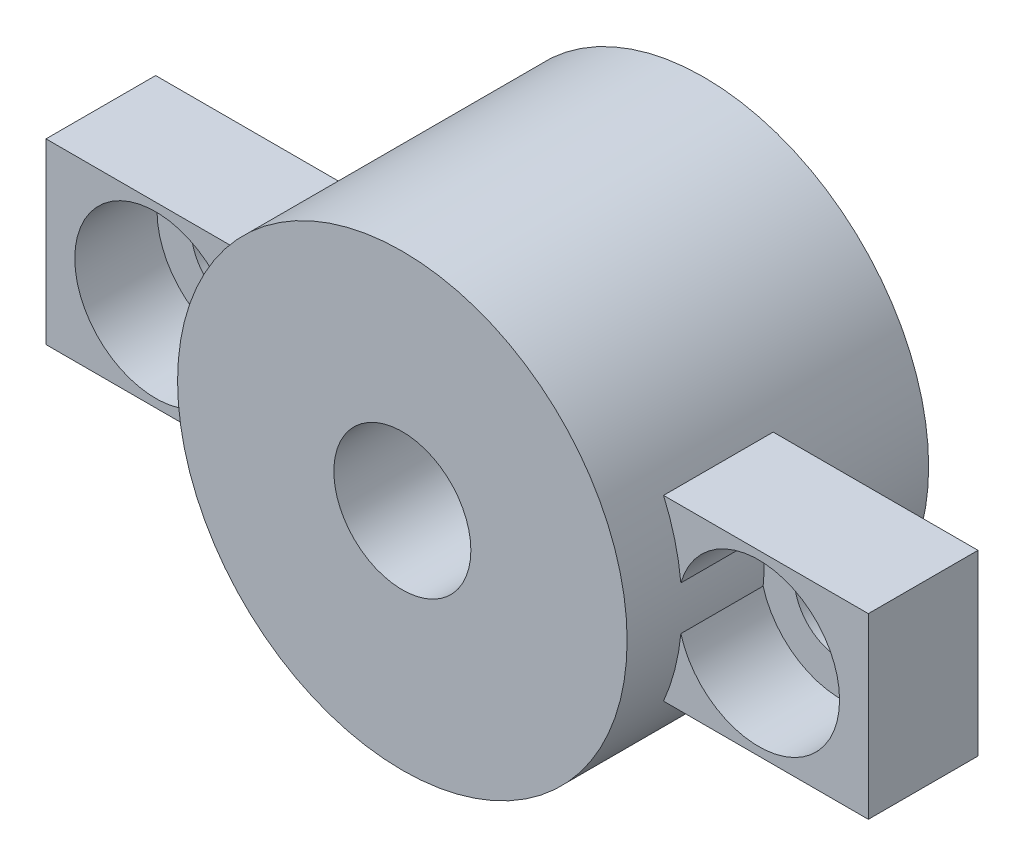
ISO-10303-21;
HEADER;
FILE_DESCRIPTION(('STEP AP214'),'2;1');
FILE_NAME('part.step','',(''),(''),'','','');
FILE_SCHEMA(('AUTOMOTIVE_DESIGN { 1 0 10303 214 1 1 1 1 }'));
ENDSEC;
DATA;
#1=APPLICATION_CONTEXT('core data for automotive mechanical design processes');
#2=APPLICATION_PROTOCOL_DEFINITION('international standard','automotive_design',2000,#1);
#3=PRODUCT_CONTEXT('',#1,'mechanical');
#4=PRODUCT('Part','Part','',(#3));
#5=PRODUCT_RELATED_PRODUCT_CATEGORY('part','',(#4));
#6=PRODUCT_DEFINITION_FORMATION('','',#4);
#7=PRODUCT_DEFINITION_CONTEXT('part definition',#1,'design');
#8=PRODUCT_DEFINITION('design','',#6,#7);
#9=PRODUCT_DEFINITION_SHAPE('','',#8);
#10=(LENGTH_UNIT() NAMED_UNIT(*) SI_UNIT(.MILLI.,.METRE.));
#11=(NAMED_UNIT(*) PLANE_ANGLE_UNIT() SI_UNIT($,.RADIAN.));
#12=(NAMED_UNIT(*) SI_UNIT($,.STERADIAN.) SOLID_ANGLE_UNIT());
#13=UNCERTAINTY_MEASURE_WITH_UNIT(LENGTH_MEASURE(1.E-05),#10,'distance_accuracy_value','');
#14=(GEOMETRIC_REPRESENTATION_CONTEXT(3) GLOBAL_UNCERTAINTY_ASSIGNED_CONTEXT((#13)) GLOBAL_UNIT_ASSIGNED_CONTEXT((#10,
#11,#12)) REPRESENTATION_CONTEXT('',''));
#15=CARTESIAN_POINT('',(0.,0.,0.));
#16=DIRECTION('',(0.,0.,1.));
#17=DIRECTION('',(1.,0.,0.));
#18=AXIS2_PLACEMENT_3D('',#15,#16,#17);
#19=CARTESIAN_POINT('',(0.,0.,-5.));
#20=DIRECTION('',(0.,0.,1.));
#21=DIRECTION('',(1.,0.,0.));
#22=AXIS2_PLACEMENT_3D('',#19,#20,#21);
#23=CYLINDRICAL_SURFACE('',#22,8.2);
#24=DIRECTION('',(0.,0.,1.));
#25=VECTOR('',#24,1.);
#26=CARTESIAN_POINT('',(7.52844605479776,-3.25,-5.));
#27=LINE('',#26,#25);
#28=CARTESIAN_POINT('',(7.52844605479776,-3.25,4.));
#29=VERTEX_POINT('',#28);
#30=CARTESIAN_POINT('',(7.52844605479776,-3.25,0.));
#31=VERTEX_POINT('',#30);
#32=EDGE_CURVE('E335',#29,#31,#27,.F.);
#33=ORIENTED_EDGE('',*,*,#32,.F.);
#34=CARTESIAN_POINT('',(0.,0.,4.));
#35=DIRECTION('',(0.,0.,1.));
#36=DIRECTION('',(1.,0.,0.));
#37=AXIS2_PLACEMENT_3D('',#34,#35,#36);
#38=CIRCLE('',#37,8.2);
#39=CARTESIAN_POINT('',(8.16079545454545,-0.800885478124208,4.));
#40=VERTEX_POINT('',#39);
#41=EDGE_CURVE('E149',#29,#40,#38,.T.);
#42=ORIENTED_EDGE('',*,*,#41,.T.);
#43=DIRECTION('',(0.,0.,1.));
#44=VECTOR('',#43,1.);
#45=CARTESIAN_POINT('',(8.16079545454545,-0.800885478124208,0.5));
#46=LINE('',#45,#44);
#47=CARTESIAN_POINT('',(8.16079545454545,-0.800885478124208,1.));
#48=VERTEX_POINT('',#47);
#49=EDGE_CURVE('E11',#48,#40,#46,.T.);
#50=ORIENTED_EDGE('',*,*,#49,.F.);
#51=CARTESIAN_POINT('',(0.,0.,1.));
#52=DIRECTION('',(0.,0.,1.));
#53=DIRECTION('',(1.,0.,0.));
#54=AXIS2_PLACEMENT_3D('',#51,#52,#53);
#55=CIRCLE('',#54,8.2);
#56=CARTESIAN_POINT('',(8.16079545454545,0.800885478124215,1.));
#57=VERTEX_POINT('',#56);
#58=EDGE_CURVE('E64',#48,#57,#55,.T.);
#59=ORIENTED_EDGE('',*,*,#58,.T.);
#60=DIRECTION('',(0.,0.,1.));
#61=VECTOR('',#60,1.);
#62=CARTESIAN_POINT('',(8.16079545454545,0.800885478124215,0.5));
#63=LINE('',#62,#61);
#64=CARTESIAN_POINT('',(8.16079545454545,0.800885478124215,4.));
#65=VERTEX_POINT('',#64);
#66=EDGE_CURVE('E49',#65,#57,#63,.F.);
#67=ORIENTED_EDGE('',*,*,#66,.F.);
#68=CARTESIAN_POINT('',(7.52844605479776,3.25,4.));
#69=VERTEX_POINT('',#68);
#70=EDGE_CURVE('E129',#65,#69,#38,.T.);
#71=ORIENTED_EDGE('',*,*,#70,.T.);
#72=DIRECTION('',(0.,0.,1.));
#73=VECTOR('',#72,1.);
#74=CARTESIAN_POINT('',(7.52844605479776,3.25,-5.));
#75=LINE('',#74,#73);
#76=CARTESIAN_POINT('',(7.52844605479776,3.25,0.));
#77=VERTEX_POINT('',#76);
#78=EDGE_CURVE('E146',#77,#69,#75,.T.);
#79=ORIENTED_EDGE('',*,*,#78,.F.);
#80=CARTESIAN_POINT('',(0.,0.,0.));
#81=DIRECTION('',(0.,0.,1.));
#82=DIRECTION('',(1.,0.,0.));
#83=AXIS2_PLACEMENT_3D('',#80,#81,#82);
#84=CIRCLE('',#83,8.2);
#85=EDGE_CURVE('E322',#31,#77,#84,.T.);
#86=ORIENTED_EDGE('',*,*,#85,.F.);
#87=EDGE_LOOP('',(#33,#42,#50,#59,#67,#71,#79,#86));
#88=FACE_BOUND('',#87,.T.);
#89=CARTESIAN_POINT('',(0.,0.,-5.));
#90=DIRECTION('',(0.,0.,1.));
#91=DIRECTION('',(1.,0.,0.));
#92=AXIS2_PLACEMENT_3D('',#89,#90,#91);
#93=CIRCLE('',#92,8.2);
#94=CARTESIAN_POINT('',(8.2,0.,-5.));
#95=VERTEX_POINT('',#94);
#96=EDGE_CURVE('E393',#95,#95,#93,.T.);
#97=ORIENTED_EDGE('',*,*,#96,.T.);
#98=EDGE_LOOP('',(#97));
#99=FACE_BOUND('',#98,.T.);
#100=CARTESIAN_POINT('',(0.,0.,6.00000000000001));
#101=DIRECTION('',(0.,0.,1.));
#102=DIRECTION('',(1.,0.,0.));
#103=AXIS2_PLACEMENT_3D('',#100,#101,#102);
#104=CIRCLE('',#103,8.2);
#105=CARTESIAN_POINT('',(8.2,0.,6.00000000000001));
#106=VERTEX_POINT('',#105);
#107=EDGE_CURVE('E384',#106,#106,#104,.T.);
#108=ORIENTED_EDGE('',*,*,#107,.F.);
#109=EDGE_LOOP('',(#108));
#110=FACE_BOUND('',#109,.T.);
#111=DIRECTION('',(0.,0.,1.));
#112=VECTOR('',#111,1.);
#113=CARTESIAN_POINT('',(-7.52844605479776,3.25,-5.));
#114=LINE('',#113,#112);
#115=CARTESIAN_POINT('',(-7.52844605479776,3.25,4.));
#116=VERTEX_POINT('',#115);
#117=CARTESIAN_POINT('',(-7.52844605479776,3.25,0.));
#118=VERTEX_POINT('',#117);
#119=EDGE_CURVE('E153',#116,#118,#114,.F.);
#120=ORIENTED_EDGE('',*,*,#119,.F.);
#121=CARTESIAN_POINT('',(-8.16079545454546,0.800885478124215,4.));
#122=VERTEX_POINT('',#121);
#123=EDGE_CURVE('E148',#116,#122,#38,.T.);
#124=ORIENTED_EDGE('',*,*,#123,.T.);
#125=DIRECTION('',(0.,0.,1.));
#126=VECTOR('',#125,1.);
#127=CARTESIAN_POINT('',(-8.16079545454546,0.800885478124215,0.5));
#128=LINE('',#127,#126);
#129=CARTESIAN_POINT('',(-8.16079545454546,0.800885478124215,1.));
#130=VERTEX_POINT('',#129);
#131=EDGE_CURVE('E326',#130,#122,#128,.T.);
#132=ORIENTED_EDGE('',*,*,#131,.F.);
#133=CARTESIAN_POINT('',(0.,0.,1.));
#134=DIRECTION('',(0.,0.,1.));
#135=DIRECTION('',(1.,0.,0.));
#136=AXIS2_PLACEMENT_3D('',#133,#134,#135);
#137=CIRCLE('',#136,8.2);
#138=CARTESIAN_POINT('',(-8.16079545454545,-0.800885478124215,1.));
#139=VERTEX_POINT('',#138);
#140=EDGE_CURVE('E56',#130,#139,#137,.T.);
#141=ORIENTED_EDGE('',*,*,#140,.T.);
#142=DIRECTION('',(0.,0.,1.));
#143=VECTOR('',#142,1.);
#144=CARTESIAN_POINT('',(-8.16079545454545,-0.800885478124215,0.5));
#145=LINE('',#144,#143);
#146=CARTESIAN_POINT('',(-8.16079545454545,-0.800885478124215,4.));
#147=VERTEX_POINT('',#146);
#148=EDGE_CURVE('E332',#147,#139,#145,.F.);
#149=ORIENTED_EDGE('',*,*,#148,.F.);
#150=CARTESIAN_POINT('',(-7.52844605479776,-3.25,4.));
#151=VERTEX_POINT('',#150);
#152=EDGE_CURVE('E317',#147,#151,#38,.T.);
#153=ORIENTED_EDGE('',*,*,#152,.T.);
#154=DIRECTION('',(0.,0.,1.));
#155=VECTOR('',#154,1.);
#156=CARTESIAN_POINT('',(-7.52844605479776,-3.25,-5.));
#157=LINE('',#156,#155);
#158=CARTESIAN_POINT('',(-7.52844605479776,-3.25,0.));
#159=VERTEX_POINT('',#158);
#160=EDGE_CURVE('E320',#159,#151,#157,.T.);
#161=ORIENTED_EDGE('',*,*,#160,.F.);
#162=EDGE_CURVE('E304',#118,#159,#84,.T.);
#163=ORIENTED_EDGE('',*,*,#162,.F.);
#164=EDGE_LOOP('',(#120,#124,#132,#141,#149,#153,#161,#163));
#165=FACE_BOUND('',#164,.T.);
#166=ADVANCED_FACE('F40',(#88,#99,#110,#165),#23,.T.);
#167=CARTESIAN_POINT('',(0.,0.,-5.));
#168=DIRECTION('',(0.,0.,1.));
#169=DIRECTION('',(1.,0.,0.));
#170=AXIS2_PLACEMENT_3D('',#167,#168,#169);
#171=PLANE('',#170);
#172=CARTESIAN_POINT('',(0.,0.,-5.));
#173=DIRECTION('',(0.,0.,1.));
#174=DIRECTION('',(1.,0.,0.));
#175=AXIS2_PLACEMENT_3D('',#172,#173,#174);
#176=CIRCLE('',#175,2.5);
#177=CARTESIAN_POINT('',(2.5,0.,-5.));
#178=VERTEX_POINT('',#177);
#179=EDGE_CURVE('E378',#178,#178,#176,.T.);
#180=ORIENTED_EDGE('',*,*,#179,.T.);
#181=EDGE_LOOP('',(#180));
#182=FACE_BOUND('',#181,.T.);
#183=ORIENTED_EDGE('',*,*,#96,.F.);
#184=EDGE_LOOP('',(#183));
#185=FACE_BOUND('',#184,.T.);
#186=ADVANCED_FACE('F260',(#182,#185),#171,.F.);
#187=CARTESIAN_POINT('',(0.,0.,6.00000000000001));
#188=DIRECTION('',(0.,0.,1.));
#189=DIRECTION('',(1.,0.,0.));
#190=AXIS2_PLACEMENT_3D('',#187,#188,#189);
#191=PLANE('',#190);
#192=ORIENTED_EDGE('',*,*,#107,.T.);
#193=EDGE_LOOP('',(#192));
#194=FACE_BOUND('',#193,.T.);
#195=CARTESIAN_POINT('',(0.,0.,6.00000000000001));
#196=DIRECTION('',(0.,0.,1.));
#197=DIRECTION('',(1.,0.,0.));
#198=AXIS2_PLACEMENT_3D('',#195,#196,#197);
#199=CIRCLE('',#198,2.5);
#200=CARTESIAN_POINT('',(2.5,0.,6.00000000000001));
#201=VERTEX_POINT('',#200);
#202=EDGE_CURVE('E381',#201,#201,#199,.T.);
#203=ORIENTED_EDGE('',*,*,#202,.F.);
#204=EDGE_LOOP('',(#203));
#205=FACE_BOUND('',#204,.T.);
#206=ADVANCED_FACE('F253',(#194,#205),#191,.T.);
#207=CARTESIAN_POINT('',(15.,-3.25,4.));
#208=DIRECTION('',(-1.,0.,0.));
#209=DIRECTION('',(0.,-1.,0.));
#210=AXIS2_PLACEMENT_3D('',#207,#208,#209);
#211=PLANE('',#210);
#212=DIRECTION('',(0.,1.,0.));
#213=VECTOR('',#212,1.);
#214=CARTESIAN_POINT('',(15.,-3.25,0.));
#215=LINE('',#214,#213);
#216=CARTESIAN_POINT('',(15.,-3.25,0.));
#217=VERTEX_POINT('',#216);
#218=CARTESIAN_POINT('',(15.,3.25,0.));
#219=VERTEX_POINT('',#218);
#220=EDGE_CURVE('E205',#217,#219,#215,.T.);
#221=ORIENTED_EDGE('',*,*,#220,.T.);
#222=DIRECTION('',(0.,0.,-1.));
#223=VECTOR('',#222,1.);
#224=CARTESIAN_POINT('',(15.,3.25,4.));
#225=LINE('',#224,#223);
#226=CARTESIAN_POINT('',(15.,3.25,4.));
#227=VERTEX_POINT('',#226);
#228=EDGE_CURVE('E217',#227,#219,#225,.T.);
#229=ORIENTED_EDGE('',*,*,#228,.F.);
#230=DIRECTION('',(0.,1.,0.));
#231=VECTOR('',#230,1.);
#232=CARTESIAN_POINT('',(15.,-3.25,4.));
#233=LINE('',#232,#231);
#234=CARTESIAN_POINT('',(15.,-3.25,4.));
#235=VERTEX_POINT('',#234);
#236=EDGE_CURVE('E186',#235,#227,#233,.T.);
#237=ORIENTED_EDGE('',*,*,#236,.F.);
#238=DIRECTION('',(0.,0.,-1.));
#239=VECTOR('',#238,1.);
#240=CARTESIAN_POINT('',(15.,-3.25,4.));
#241=LINE('',#240,#239);
#242=EDGE_CURVE('E221',#235,#217,#241,.T.);
#243=ORIENTED_EDGE('',*,*,#242,.T.);
#244=EDGE_LOOP('',(#221,#229,#237,#243));
#245=FACE_BOUND('',#244,.T.);
#246=ADVANCED_FACE('F243',(#245),#211,.F.);
#247=CARTESIAN_POINT('',(11.,0.,0.));
#248=DIRECTION('',(0.,0.,1.));
#249=DIRECTION('',(1.,0.,0.));
#250=AXIS2_PLACEMENT_3D('',#247,#248,#249);
#251=CYLINDRICAL_SURFACE('',#250,1.7);
#252=CARTESIAN_POINT('',(11.,0.,0.));
#253=DIRECTION('',(0.,0.,1.));
#254=DIRECTION('',(1.,0.,0.));
#255=AXIS2_PLACEMENT_3D('',#252,#253,#254);
#256=CIRCLE('',#255,1.7);
#257=CARTESIAN_POINT('',(12.7,0.,0.));
#258=VERTEX_POINT('',#257);
#259=EDGE_CURVE('E169',#258,#258,#256,.T.);
#260=ORIENTED_EDGE('',*,*,#259,.F.);
#261=EDGE_LOOP('',(#260));
#262=FACE_BOUND('',#261,.T.);
#263=CARTESIAN_POINT('',(11.,0.,1.));
#264=DIRECTION('',(0.,0.,1.));
#265=DIRECTION('',(1.,0.,0.));
#266=AXIS2_PLACEMENT_3D('',#263,#264,#265);
#267=CIRCLE('',#266,1.7);
#268=CARTESIAN_POINT('',(12.7,0.,1.));
#269=VERTEX_POINT('',#268);
#270=EDGE_CURVE('E173',#269,#269,#267,.F.);
#271=ORIENTED_EDGE('',*,*,#270,.F.);
#272=EDGE_LOOP('',(#271));
#273=FACE_BOUND('',#272,.T.);
#274=ADVANCED_FACE('F240',(#262,#273),#251,.F.);
#275=CARTESIAN_POINT('',(15.,3.25,4.));
#276=DIRECTION('',(0.,-1.,0.));
#277=DIRECTION('',(1.,0.,0.));
#278=AXIS2_PLACEMENT_3D('',#275,#276,#277);
#279=PLANE('',#278);
#280=DIRECTION('',(-1.,0.,0.));
#281=VECTOR('',#280,1.);
#282=CARTESIAN_POINT('',(15.,3.25,0.));
#283=LINE('',#282,#281);
#284=EDGE_CURVE('E208',#219,#77,#283,.T.);
#285=ORIENTED_EDGE('',*,*,#284,.T.);
#286=ORIENTED_EDGE('',*,*,#78,.T.);
#287=DIRECTION('',(-1.,0.,0.));
#288=VECTOR('',#287,1.);
#289=CARTESIAN_POINT('',(15.,3.25,4.));
#290=LINE('',#289,#288);
#291=EDGE_CURVE('E144',#227,#69,#290,.T.);
#292=ORIENTED_EDGE('',*,*,#291,.F.);
#293=ORIENTED_EDGE('',*,*,#228,.T.);
#294=EDGE_LOOP('',(#285,#286,#292,#293));
#295=FACE_BOUND('',#294,.T.);
#296=ADVANCED_FACE('F242',(#295),#279,.F.);
#297=CARTESIAN_POINT('',(15.,-3.25,4.));
#298=DIRECTION('',(0.,1.,0.));
#299=DIRECTION('',(-1.,0.,0.));
#300=AXIS2_PLACEMENT_3D('',#297,#298,#299);
#301=PLANE('',#300);
#302=DIRECTION('',(1.,0.,0.));
#303=VECTOR('',#302,1.);
#304=CARTESIAN_POINT('',(15.,-3.25,4.));
#305=LINE('',#304,#303);
#306=EDGE_CURVE('E183',#29,#235,#305,.T.);
#307=ORIENTED_EDGE('',*,*,#306,.F.);
#308=ORIENTED_EDGE('',*,*,#32,.T.);
#309=DIRECTION('',(1.,0.,0.));
#310=VECTOR('',#309,1.);
#311=CARTESIAN_POINT('',(15.,-3.25,0.));
#312=LINE('',#311,#310);
#313=EDGE_CURVE('E202',#31,#217,#312,.T.);
#314=ORIENTED_EDGE('',*,*,#313,.T.);
#315=ORIENTED_EDGE('',*,*,#242,.F.);
#316=EDGE_LOOP('',(#307,#308,#314,#315));
#317=FACE_BOUND('',#316,.T.);
#318=ADVANCED_FACE('F250',(#317),#301,.F.);
#319=CARTESIAN_POINT('',(0.,0.,0.));
#320=DIRECTION('',(0.,0.,1.));
#321=DIRECTION('',(1.,0.,0.));
#322=AXIS2_PLACEMENT_3D('',#319,#320,#321);
#323=PLANE('',#322);
#324=ORIENTED_EDGE('',*,*,#259,.T.);
#325=EDGE_LOOP('',(#324));
#326=FACE_BOUND('',#325,.T.);
#327=ORIENTED_EDGE('',*,*,#313,.F.);
#328=ORIENTED_EDGE('',*,*,#85,.T.);
#329=ORIENTED_EDGE('',*,*,#284,.F.);
#330=ORIENTED_EDGE('',*,*,#220,.F.);
#331=EDGE_LOOP('',(#327,#328,#329,#330));
#332=FACE_BOUND('',#331,.T.);
#333=ADVANCED_FACE('F283',(#326,#332),#323,.F.);
#334=CARTESIAN_POINT('',(11.,0.,1.));
#335=DIRECTION('',(0.,0.,1.));
#336=DIRECTION('',(1.,0.,0.));
#337=AXIS2_PLACEMENT_3D('',#334,#335,#336);
#338=CYLINDRICAL_SURFACE('',#337,2.95);
#339=CARTESIAN_POINT('',(11.,0.,1.));
#340=DIRECTION('',(0.,0.,1.));
#341=DIRECTION('',(1.,0.,0.));
#342=AXIS2_PLACEMENT_3D('',#339,#340,#341);
#343=CIRCLE('',#342,2.95);
#344=EDGE_CURVE('E152',#48,#57,#343,.T.);
#345=ORIENTED_EDGE('',*,*,#344,.F.);
#346=ORIENTED_EDGE('',*,*,#49,.T.);
#347=CARTESIAN_POINT('',(11.,0.,4.));
#348=DIRECTION('',(0.,0.,1.));
#349=DIRECTION('',(1.,0.,0.));
#350=AXIS2_PLACEMENT_3D('',#347,#348,#349);
#351=CIRCLE('',#350,2.95);
#352=EDGE_CURVE('E142',#40,#65,#351,.T.);
#353=ORIENTED_EDGE('',*,*,#352,.T.);
#354=ORIENTED_EDGE('',*,*,#66,.T.);
#355=EDGE_LOOP('',(#345,#346,#353,#354));
#356=FACE_BOUND('',#355,.T.);
#357=ADVANCED_FACE('F150',(#356),#338,.F.);
#358=CARTESIAN_POINT('',(11.,0.,1.));
#359=DIRECTION('',(0.,0.,1.));
#360=DIRECTION('',(1.,0.,0.));
#361=AXIS2_PLACEMENT_3D('',#358,#359,#360);
#362=PLANE('',#361);
#363=ORIENTED_EDGE('',*,*,#58,.F.);
#364=ORIENTED_EDGE('',*,*,#344,.T.);
#365=EDGE_LOOP('',(#363,#364));
#366=FACE_BOUND('',#365,.T.);
#367=ORIENTED_EDGE('',*,*,#270,.T.);
#368=EDGE_LOOP('',(#367));
#369=FACE_BOUND('',#368,.T.);
#370=ADVANCED_FACE('F238',(#366,#369),#362,.T.);
#371=CARTESIAN_POINT('',(0.,0.,4.));
#372=DIRECTION('',(0.,0.,1.));
#373=DIRECTION('',(1.,0.,0.));
#374=AXIS2_PLACEMENT_3D('',#371,#372,#373);
#375=PLANE('',#374);
#376=ORIENTED_EDGE('',*,*,#70,.F.);
#377=ORIENTED_EDGE('',*,*,#352,.F.);
#378=ORIENTED_EDGE('',*,*,#41,.F.);
#379=ORIENTED_EDGE('',*,*,#306,.T.);
#380=ORIENTED_EDGE('',*,*,#236,.T.);
#381=ORIENTED_EDGE('',*,*,#291,.T.);
#382=EDGE_LOOP('',(#376,#377,#378,#379,#380,#381));
#383=FACE_BOUND('',#382,.T.);
#384=ADVANCED_FACE('F140',(#383),#375,.T.);
#385=CARTESIAN_POINT('',(-15.,-3.25,4.));
#386=DIRECTION('',(1.,0.,0.));
#387=DIRECTION('',(0.,0.,-1.));
#388=AXIS2_PLACEMENT_3D('',#385,#386,#387);
#389=PLANE('',#388);
#390=DIRECTION('',(0.,-1.,0.));
#391=VECTOR('',#390,1.);
#392=CARTESIAN_POINT('',(-15.,-3.25,0.));
#393=LINE('',#392,#391);
#394=CARTESIAN_POINT('',(-15.,3.25,0.));
#395=VERTEX_POINT('',#394);
#396=CARTESIAN_POINT('',(-15.,-3.25,0.));
#397=VERTEX_POINT('',#396);
#398=EDGE_CURVE('E168',#395,#397,#393,.T.);
#399=ORIENTED_EDGE('',*,*,#398,.T.);
#400=DIRECTION('',(0.,0.,-1.));
#401=VECTOR('',#400,1.);
#402=CARTESIAN_POINT('',(-15.,-3.25,4.));
#403=LINE('',#402,#401);
#404=CARTESIAN_POINT('',(-15.,-3.25,4.));
#405=VERTEX_POINT('',#404);
#406=EDGE_CURVE('E136',#405,#397,#403,.T.);
#407=ORIENTED_EDGE('',*,*,#406,.F.);
#408=DIRECTION('',(0.,-1.,0.));
#409=VECTOR('',#408,1.);
#410=CARTESIAN_POINT('',(-15.,-3.25,4.));
#411=LINE('',#410,#409);
#412=CARTESIAN_POINT('',(-15.,3.25,4.));
#413=VERTEX_POINT('',#412);
#414=EDGE_CURVE('E174',#413,#405,#411,.T.);
#415=ORIENTED_EDGE('',*,*,#414,.F.);
#416=DIRECTION('',(0.,0.,-1.));
#417=VECTOR('',#416,1.);
#418=CARTESIAN_POINT('',(-15.,3.25,4.));
#419=LINE('',#418,#417);
#420=EDGE_CURVE('E194',#413,#395,#419,.T.);
#421=ORIENTED_EDGE('',*,*,#420,.T.);
#422=EDGE_LOOP('',(#399,#407,#415,#421));
#423=FACE_BOUND('',#422,.T.);
#424=ADVANCED_FACE('F42',(#423),#389,.F.);
#425=CARTESIAN_POINT('',(-11.,0.,0.));
#426=DIRECTION('',(0.,0.,1.));
#427=DIRECTION('',(1.,0.,0.));
#428=AXIS2_PLACEMENT_3D('',#425,#426,#427);
#429=CYLINDRICAL_SURFACE('',#428,1.7);
#430=CARTESIAN_POINT('',(-11.,0.,0.));
#431=DIRECTION('',(0.,0.,1.));
#432=DIRECTION('',(1.,0.,0.));
#433=AXIS2_PLACEMENT_3D('',#430,#431,#432);
#434=CIRCLE('',#433,1.7);
#435=CARTESIAN_POINT('',(-9.3,0.,0.));
#436=VERTEX_POINT('',#435);
#437=EDGE_CURVE('E164',#436,#436,#434,.T.);
#438=ORIENTED_EDGE('',*,*,#437,.F.);
#439=EDGE_LOOP('',(#438));
#440=FACE_BOUND('',#439,.T.);
#441=CARTESIAN_POINT('',(-11.,0.,1.));
#442=DIRECTION('',(0.,0.,1.));
#443=DIRECTION('',(1.,0.,0.));
#444=AXIS2_PLACEMENT_3D('',#441,#442,#443);
#445=CIRCLE('',#444,1.7);
#446=CARTESIAN_POINT('',(-9.3,0.,1.));
#447=VERTEX_POINT('',#446);
#448=EDGE_CURVE('E228',#447,#447,#445,.F.);
#449=ORIENTED_EDGE('',*,*,#448,.F.);
#450=EDGE_LOOP('',(#449));
#451=FACE_BOUND('',#450,.T.);
#452=ADVANCED_FACE('F277',(#440,#451),#429,.F.);
#453=CARTESIAN_POINT('',(-11.,0.,1.));
#454=DIRECTION('',(0.,0.,1.));
#455=DIRECTION('',(1.,0.,0.));
#456=AXIS2_PLACEMENT_3D('',#453,#454,#455);
#457=CYLINDRICAL_SURFACE('',#456,2.95);
#458=CARTESIAN_POINT('',(-11.,0.,1.));
#459=DIRECTION('',(0.,0.,1.));
#460=DIRECTION('',(1.,0.,0.));
#461=AXIS2_PLACEMENT_3D('',#458,#459,#460);
#462=CIRCLE('',#461,2.95);
#463=EDGE_CURVE('E232',#130,#139,#462,.T.);
#464=ORIENTED_EDGE('',*,*,#463,.F.);
#465=ORIENTED_EDGE('',*,*,#131,.T.);
#466=CARTESIAN_POINT('',(-11.,0.,4.));
#467=DIRECTION('',(0.,0.,1.));
#468=DIRECTION('',(1.,0.,0.));
#469=AXIS2_PLACEMENT_3D('',#466,#467,#468);
#470=CIRCLE('',#469,2.95);
#471=EDGE_CURVE('E158',#122,#147,#470,.T.);
#472=ORIENTED_EDGE('',*,*,#471,.T.);
#473=ORIENTED_EDGE('',*,*,#148,.T.);
#474=EDGE_LOOP('',(#464,#465,#472,#473));
#475=FACE_BOUND('',#474,.T.);
#476=ADVANCED_FACE('F273',(#475),#457,.F.);
#477=CARTESIAN_POINT('',(-11.,0.,1.));
#478=DIRECTION('',(0.,0.,1.));
#479=DIRECTION('',(1.,0.,0.));
#480=AXIS2_PLACEMENT_3D('',#477,#478,#479);
#481=PLANE('',#480);
#482=ORIENTED_EDGE('',*,*,#140,.F.);
#483=ORIENTED_EDGE('',*,*,#463,.T.);
#484=EDGE_LOOP('',(#482,#483));
#485=FACE_BOUND('',#484,.T.);
#486=ORIENTED_EDGE('',*,*,#448,.T.);
#487=EDGE_LOOP('',(#486));
#488=FACE_BOUND('',#487,.T.);
#489=ADVANCED_FACE('F269',(#485,#488),#481,.T.);
#490=CARTESIAN_POINT('',(-7.20052081449669,-3.25,4.));
#491=DIRECTION('',(0.,1.,0.));
#492=DIRECTION('',(-1.,0.,0.));
#493=AXIS2_PLACEMENT_3D('',#490,#491,#492);
#494=PLANE('',#493);
#495=DIRECTION('',(1.,0.,0.));
#496=VECTOR('',#495,1.);
#497=CARTESIAN_POINT('',(-7.20052081449669,-3.25,0.));
#498=LINE('',#497,#496);
#499=EDGE_CURVE('E198',#397,#159,#498,.T.);
#500=ORIENTED_EDGE('',*,*,#499,.T.);
#501=ORIENTED_EDGE('',*,*,#160,.T.);
#502=DIRECTION('',(1.,0.,0.));
#503=VECTOR('',#502,1.);
#504=CARTESIAN_POINT('',(-7.20052081449669,-3.25,4.));
#505=LINE('',#504,#503);
#506=EDGE_CURVE('E178',#405,#151,#505,.T.);
#507=ORIENTED_EDGE('',*,*,#506,.F.);
#508=ORIENTED_EDGE('',*,*,#406,.T.);
#509=EDGE_LOOP('',(#500,#501,#507,#508));
#510=FACE_BOUND('',#509,.T.);
#511=ADVANCED_FACE('F272',(#510),#494,.F.);
#512=CARTESIAN_POINT('',(-7.20052081449669,3.25,4.));
#513=DIRECTION('',(0.,-1.,0.));
#514=DIRECTION('',(1.,0.,0.));
#515=AXIS2_PLACEMENT_3D('',#512,#513,#514);
#516=PLANE('',#515);
#517=DIRECTION('',(-1.,0.,0.));
#518=VECTOR('',#517,1.);
#519=CARTESIAN_POINT('',(-7.20052081449669,3.25,4.));
#520=LINE('',#519,#518);
#521=EDGE_CURVE('E191',#116,#413,#520,.T.);
#522=ORIENTED_EDGE('',*,*,#521,.F.);
#523=ORIENTED_EDGE('',*,*,#119,.T.);
#524=DIRECTION('',(-1.,0.,0.));
#525=VECTOR('',#524,1.);
#526=CARTESIAN_POINT('',(-7.20052081449669,3.25,0.));
#527=LINE('',#526,#525);
#528=EDGE_CURVE('E179',#118,#395,#527,.T.);
#529=ORIENTED_EDGE('',*,*,#528,.T.);
#530=ORIENTED_EDGE('',*,*,#420,.F.);
#531=EDGE_LOOP('',(#522,#523,#529,#530));
#532=FACE_BOUND('',#531,.T.);
#533=ADVANCED_FACE('F299',(#532),#516,.F.);
#534=ORIENTED_EDGE('',*,*,#437,.T.);
#535=EDGE_LOOP('',(#534));
#536=FACE_BOUND('',#535,.T.);
#537=ORIENTED_EDGE('',*,*,#528,.F.);
#538=ORIENTED_EDGE('',*,*,#162,.T.);
#539=ORIENTED_EDGE('',*,*,#499,.F.);
#540=ORIENTED_EDGE('',*,*,#398,.F.);
#541=EDGE_LOOP('',(#537,#538,#539,#540));
#542=FACE_BOUND('',#541,.T.);
#543=ADVANCED_FACE('F295',(#536,#542),#323,.F.);
#544=ORIENTED_EDGE('',*,*,#123,.F.);
#545=ORIENTED_EDGE('',*,*,#521,.T.);
#546=ORIENTED_EDGE('',*,*,#414,.T.);
#547=ORIENTED_EDGE('',*,*,#506,.T.);
#548=ORIENTED_EDGE('',*,*,#152,.F.);
#549=ORIENTED_EDGE('',*,*,#471,.F.);
#550=EDGE_LOOP('',(#544,#545,#546,#547,#548,#549));
#551=FACE_BOUND('',#550,.T.);
#552=ADVANCED_FACE('F298',(#551),#375,.T.);
#553=CARTESIAN_POINT('',(0.,0.,4.));
#554=DIRECTION('',(0.,0.,-1.));
#555=DIRECTION('',(-1.,0.,0.));
#556=AXIS2_PLACEMENT_3D('',#553,#554,#555);
#557=CYLINDRICAL_SURFACE('',#556,2.5);
#558=ORIENTED_EDGE('',*,*,#179,.F.);
#559=EDGE_LOOP('',(#558));
#560=FACE_BOUND('',#559,.T.);
#561=ORIENTED_EDGE('',*,*,#202,.T.);
#562=EDGE_LOOP('',(#561));
#563=FACE_BOUND('',#562,.T.);
#564=ADVANCED_FACE('F370',(#560,#563),#557,.F.);
#565=CLOSED_SHELL('',(#166,#186,#206,#246,#274,#296,#318,#333,#357,#370,#384,#424,#452,#476,
#489,#511,#533,#543,#552,#564));
#566=MANIFOLD_SOLID_BREP('B2',#565);
#567=ADVANCED_BREP_SHAPE_REPRESENTATION('',(#18,#566),#14);
#568=SHAPE_DEFINITION_REPRESENTATION(#9,#567);
ENDSEC;
END-ISO-10303-21;
